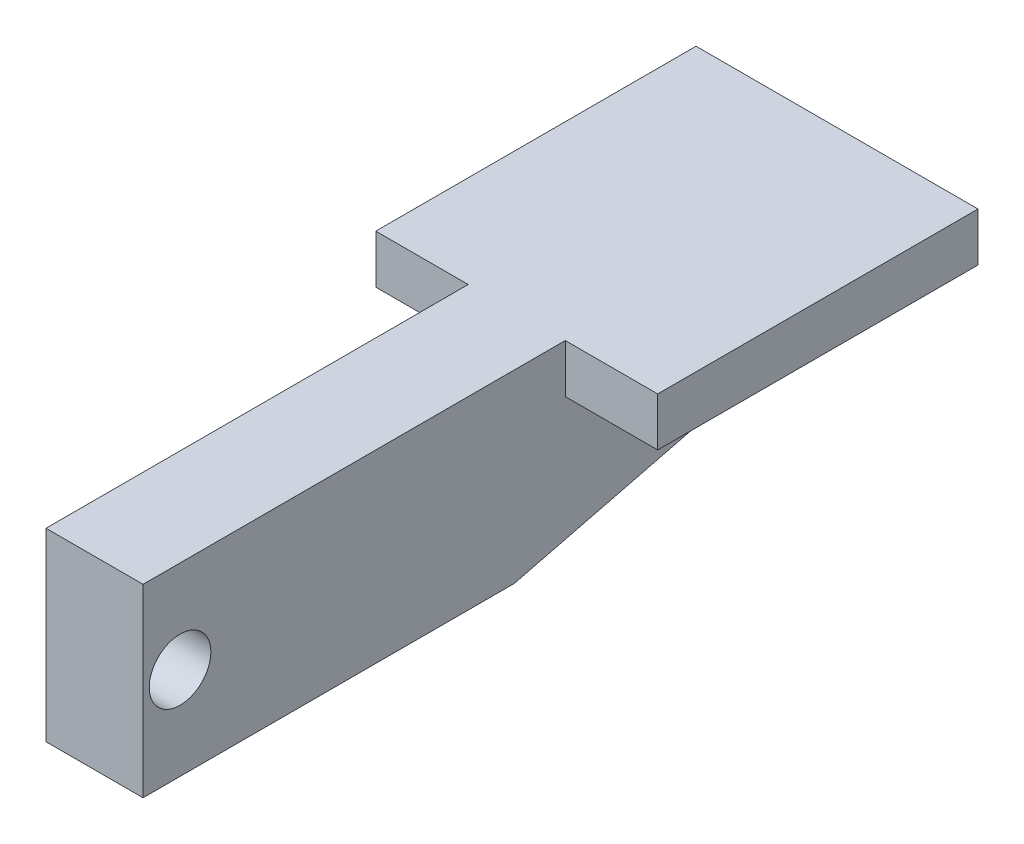
ISO-10303-21;
HEADER;
FILE_DESCRIPTION(('STEP AP214'),'2;1');
FILE_NAME('part.step','',(''),(''),'','','');
FILE_SCHEMA(('AUTOMOTIVE_DESIGN { 1 0 10303 214 1 1 1 1 }'));
ENDSEC;
DATA;
#1=APPLICATION_CONTEXT('core data for automotive mechanical design processes');
#2=APPLICATION_PROTOCOL_DEFINITION('international standard','automotive_design',2000,#1);
#3=PRODUCT_CONTEXT('',#1,'mechanical');
#4=PRODUCT('Part','Part','',(#3));
#5=PRODUCT_RELATED_PRODUCT_CATEGORY('part','',(#4));
#6=PRODUCT_DEFINITION_FORMATION('','',#4);
#7=PRODUCT_DEFINITION_CONTEXT('part definition',#1,'design');
#8=PRODUCT_DEFINITION('design','',#6,#7);
#9=PRODUCT_DEFINITION_SHAPE('','',#8);
#10=(LENGTH_UNIT() NAMED_UNIT(*) SI_UNIT(.MILLI.,.METRE.));
#11=(NAMED_UNIT(*) PLANE_ANGLE_UNIT() SI_UNIT($,.RADIAN.));
#12=(NAMED_UNIT(*) SI_UNIT($,.STERADIAN.) SOLID_ANGLE_UNIT());
#13=UNCERTAINTY_MEASURE_WITH_UNIT(LENGTH_MEASURE(1.E-05),#10,'distance_accuracy_value','');
#14=(GEOMETRIC_REPRESENTATION_CONTEXT(3) GLOBAL_UNCERTAINTY_ASSIGNED_CONTEXT((#13)) GLOBAL_UNIT_ASSIGNED_CONTEXT((#10,
#11,#12)) REPRESENTATION_CONTEXT('',''));
#15=CARTESIAN_POINT('',(0.,0.,0.));
#16=DIRECTION('',(0.,0.,1.));
#17=DIRECTION('',(1.,0.,0.));
#18=AXIS2_PLACEMENT_3D('',#15,#16,#17);
#19=CARTESIAN_POINT('',(0.,0.,0.));
#20=DIRECTION('',(1.,0.,0.));
#21=DIRECTION('',(0.,0.,-1.));
#22=AXIS2_PLACEMENT_3D('',#19,#20,#21);
#23=PLANE('',#22);
#24=CARTESIAN_POINT('',(0.,0.,68.88));
#25=DIRECTION('',(1.,0.,0.));
#26=DIRECTION('',(0.,0.,-1.));
#27=AXIS2_PLACEMENT_3D('',#24,#25,#26);
#28=CIRCLE('',#27,6.35);
#29=CARTESIAN_POINT('',(0.,0.,62.53));
#30=VERTEX_POINT('',#29);
#31=EDGE_CURVE('E216',#30,#30,#28,.T.);
#32=ORIENTED_EDGE('',*,*,#31,.T.);
#33=EDGE_LOOP('',(#32));
#34=FACE_BOUND('',#33,.T.);
#35=DIRECTION('',(0.,1.,0.));
#36=VECTOR('',#35,1.);
#37=CARTESIAN_POINT('',(0.,19.05,-10.5));
#38=LINE('',#37,#36);
#39=CARTESIAN_POINT('',(0.,9.05,-10.5));
#40=VERTEX_POINT('',#39);
#41=CARTESIAN_POINT('',(0.,19.05,-10.5));
#42=VERTEX_POINT('',#41);
#43=EDGE_CURVE('E133',#40,#42,#38,.T.);
#44=ORIENTED_EDGE('',*,*,#43,.F.);
#45=DIRECTION('',(0.,0.,1.));
#46=VECTOR('',#45,1.);
#47=CARTESIAN_POINT('',(0.,9.05,-76.5));
#48=LINE('',#47,#46);
#49=CARTESIAN_POINT('',(0.,9.05,-76.5));
#50=VERTEX_POINT('',#49);
#51=EDGE_CURVE('E47',#50,#40,#48,.T.);
#52=ORIENTED_EDGE('',*,*,#51,.F.);
#53=DIRECTION('',(0.,1.,0.));
#54=VECTOR('',#53,1.);
#55=CARTESIAN_POINT('',(0.,19.05,-76.5));
#56=LINE('',#55,#54);
#57=CARTESIAN_POINT('',(0.,0.,-76.5));
#58=VERTEX_POINT('',#57);
#59=EDGE_CURVE('E137',#58,#50,#56,.T.);
#60=ORIENTED_EDGE('',*,*,#59,.F.);
#61=DIRECTION('',(0.,0.241640143717287,-0.97036593146312));
#62=VECTOR('',#61,1.);
#63=CARTESIAN_POINT('',(0.,-19.05,0.));
#64=LINE('',#63,#62);
#65=CARTESIAN_POINT('',(0.,-19.05,0.));
#66=VERTEX_POINT('',#65);
#67=EDGE_CURVE('E184',#66,#58,#64,.T.);
#68=ORIENTED_EDGE('',*,*,#67,.F.);
#69=DIRECTION('',(0.,0.,-1.));
#70=VECTOR('',#69,1.);
#71=CARTESIAN_POINT('',(0.,-19.05,76.5));
#72=LINE('',#71,#70);
#73=CARTESIAN_POINT('',(0.,-19.05,76.5));
#74=VERTEX_POINT('',#73);
#75=EDGE_CURVE('E182',#74,#66,#72,.T.);
#76=ORIENTED_EDGE('',*,*,#75,.F.);
#77=DIRECTION('',(0.,-1.,0.));
#78=VECTOR('',#77,1.);
#79=CARTESIAN_POINT('',(0.,19.05,76.5));
#80=LINE('',#79,#78);
#81=CARTESIAN_POINT('',(0.,19.05,76.5));
#82=VERTEX_POINT('',#81);
#83=EDGE_CURVE('E167',#82,#74,#80,.T.);
#84=ORIENTED_EDGE('',*,*,#83,.F.);
#85=DIRECTION('',(0.,0.,1.));
#86=VECTOR('',#85,1.);
#87=CARTESIAN_POINT('',(0.,19.05,76.5));
#88=LINE('',#87,#86);
#89=EDGE_CURVE('E53',#42,#82,#88,.T.);
#90=ORIENTED_EDGE('',*,*,#89,.F.);
#91=EDGE_LOOP('',(#44,#52,#60,#68,#76,#84,#90));
#92=FACE_BOUND('',#91,.T.);
#93=ADVANCED_FACE('F32',(#34,#92),#23,.F.);
#94=CARTESIAN_POINT('',(20.,19.05,76.5));
#95=DIRECTION('',(0.,0.,-1.));
#96=DIRECTION('',(-1.,0.,0.));
#97=AXIS2_PLACEMENT_3D('',#94,#95,#96);
#98=PLANE('',#97);
#99=ORIENTED_EDGE('',*,*,#83,.T.);
#100=DIRECTION('',(-1.,0.,0.));
#101=VECTOR('',#100,1.);
#102=CARTESIAN_POINT('',(20.,-19.05,76.5));
#103=LINE('',#102,#101);
#104=CARTESIAN_POINT('',(20.,-19.05,76.5));
#105=VERTEX_POINT('',#104);
#106=EDGE_CURVE('E11',#105,#74,#103,.T.);
#107=ORIENTED_EDGE('',*,*,#106,.F.);
#108=DIRECTION('',(0.,-1.,0.));
#109=VECTOR('',#108,1.);
#110=CARTESIAN_POINT('',(20.,19.05,76.5));
#111=LINE('',#110,#109);
#112=CARTESIAN_POINT('',(20.,19.05,76.5));
#113=VERTEX_POINT('',#112);
#114=EDGE_CURVE('E168',#113,#105,#111,.T.);
#115=ORIENTED_EDGE('',*,*,#114,.F.);
#116=DIRECTION('',(-1.,0.,0.));
#117=VECTOR('',#116,1.);
#118=CARTESIAN_POINT('',(20.,19.05,76.5));
#119=LINE('',#118,#117);
#120=EDGE_CURVE('E179',#113,#82,#119,.T.);
#121=ORIENTED_EDGE('',*,*,#120,.T.);
#122=EDGE_LOOP('',(#99,#107,#115,#121));
#123=FACE_BOUND('',#122,.T.);
#124=ADVANCED_FACE('F34',(#123),#98,.F.);
#125=CARTESIAN_POINT('',(20.,-19.05,76.5));
#126=DIRECTION('',(0.,1.,0.));
#127=DIRECTION('',(0.,0.,1.));
#128=AXIS2_PLACEMENT_3D('',#125,#126,#127);
#129=PLANE('',#128);
#130=ORIENTED_EDGE('',*,*,#75,.T.);
#131=DIRECTION('',(-1.,0.,0.));
#132=VECTOR('',#131,1.);
#133=CARTESIAN_POINT('',(20.,-19.05,0.));
#134=LINE('',#133,#132);
#135=CARTESIAN_POINT('',(20.,-19.05,0.));
#136=VERTEX_POINT('',#135);
#137=EDGE_CURVE('E40',#136,#66,#134,.T.);
#138=ORIENTED_EDGE('',*,*,#137,.F.);
#139=DIRECTION('',(0.,0.,-1.));
#140=VECTOR('',#139,1.);
#141=CARTESIAN_POINT('',(20.,-19.05,76.5));
#142=LINE('',#141,#140);
#143=EDGE_CURVE('E171',#105,#136,#142,.T.);
#144=ORIENTED_EDGE('',*,*,#143,.F.);
#145=ORIENTED_EDGE('',*,*,#106,.T.);
#146=EDGE_LOOP('',(#130,#138,#144,#145));
#147=FACE_BOUND('',#146,.T.);
#148=ADVANCED_FACE('F202',(#147),#129,.F.);
#149=CARTESIAN_POINT('',(20.,-19.05,0.));
#150=DIRECTION('',(0.,0.97036593146312,0.241640143717287));
#151=DIRECTION('',(0.,-0.241640143717287,0.97036593146312));
#152=AXIS2_PLACEMENT_3D('',#149,#150,#151);
#153=PLANE('',#152);
#154=ORIENTED_EDGE('',*,*,#67,.T.);
#155=DIRECTION('',(-1.,0.,0.));
#156=VECTOR('',#155,1.);
#157=CARTESIAN_POINT('',(20.,0.,-76.5));
#158=LINE('',#157,#156);
#159=CARTESIAN_POINT('',(20.,0.,-76.5));
#160=VERTEX_POINT('',#159);
#161=EDGE_CURVE('E192',#160,#58,#158,.T.);
#162=ORIENTED_EDGE('',*,*,#161,.F.);
#163=DIRECTION('',(0.,0.241640143717287,-0.97036593146312));
#164=VECTOR('',#163,1.);
#165=CARTESIAN_POINT('',(20.,-19.05,0.));
#166=LINE('',#165,#164);
#167=EDGE_CURVE('E173',#136,#160,#166,.T.);
#168=ORIENTED_EDGE('',*,*,#167,.F.);
#169=ORIENTED_EDGE('',*,*,#137,.T.);
#170=EDGE_LOOP('',(#154,#162,#168,#169));
#171=FACE_BOUND('',#170,.T.);
#172=ADVANCED_FACE('F198',(#171),#153,.F.);
#173=CARTESIAN_POINT('',(20.,19.05,-76.5));
#174=DIRECTION('',(0.,0.,1.));
#175=DIRECTION('',(1.,0.,0.));
#176=AXIS2_PLACEMENT_3D('',#173,#174,#175);
#177=PLANE('',#176);
#178=ORIENTED_EDGE('',*,*,#59,.T.);
#179=DIRECTION('',(1.,0.,0.));
#180=VECTOR('',#179,1.);
#181=CARTESIAN_POINT('',(-19.05,9.05,-76.5));
#182=LINE('',#181,#180);
#183=CARTESIAN_POINT('',(-19.05,9.05,-76.5));
#184=VERTEX_POINT('',#183);
#185=EDGE_CURVE('E119',#184,#50,#182,.T.);
#186=ORIENTED_EDGE('',*,*,#185,.F.);
#187=DIRECTION('',(0.,-1.,0.));
#188=VECTOR('',#187,1.);
#189=CARTESIAN_POINT('',(-19.05,19.05,-76.5));
#190=LINE('',#189,#188);
#191=CARTESIAN_POINT('',(-19.05,19.05,-76.5));
#192=VERTEX_POINT('',#191);
#193=EDGE_CURVE('E125',#192,#184,#190,.T.);
#194=ORIENTED_EDGE('',*,*,#193,.F.);
#195=DIRECTION('',(-1.,0.,0.));
#196=VECTOR('',#195,1.);
#197=CARTESIAN_POINT('',(20.,19.05,-76.5));
#198=LINE('',#197,#196);
#199=CARTESIAN_POINT('',(39.05,19.05,-76.5));
#200=VERTEX_POINT('',#199);
#201=EDGE_CURVE('E190',#200,#192,#198,.T.);
#202=ORIENTED_EDGE('',*,*,#201,.F.);
#203=DIRECTION('',(0.,1.,0.));
#204=VECTOR('',#203,1.);
#205=CARTESIAN_POINT('',(39.05,19.05,-76.5));
#206=LINE('',#205,#204);
#207=CARTESIAN_POINT('',(39.05,9.05,-76.5));
#208=VERTEX_POINT('',#207);
#209=EDGE_CURVE('E147',#208,#200,#206,.T.);
#210=ORIENTED_EDGE('',*,*,#209,.F.);
#211=DIRECTION('',(-1.,0.,0.));
#212=VECTOR('',#211,1.);
#213=CARTESIAN_POINT('',(39.05,9.05,-76.5));
#214=LINE('',#213,#212);
#215=CARTESIAN_POINT('',(20.,9.04999999999999,-76.5));
#216=VERTEX_POINT('',#215);
#217=EDGE_CURVE('E155',#208,#216,#214,.T.);
#218=ORIENTED_EDGE('',*,*,#217,.T.);
#219=DIRECTION('',(0.,1.,0.));
#220=VECTOR('',#219,1.);
#221=CARTESIAN_POINT('',(20.,19.05,-76.5));
#222=LINE('',#221,#220);
#223=EDGE_CURVE('E175',#160,#216,#222,.T.);
#224=ORIENTED_EDGE('',*,*,#223,.F.);
#225=ORIENTED_EDGE('',*,*,#161,.T.);
#226=EDGE_LOOP('',(#178,#186,#194,#202,#210,#218,#224,#225));
#227=FACE_BOUND('',#226,.T.);
#228=ADVANCED_FACE('F135',(#227),#177,.F.);
#229=CARTESIAN_POINT('',(20.,19.05,76.5));
#230=DIRECTION('',(0.,-1.,0.));
#231=DIRECTION('',(0.,0.,-1.));
#232=AXIS2_PLACEMENT_3D('',#229,#230,#231);
#233=PLANE('',#232);
#234=ORIENTED_EDGE('',*,*,#201,.T.);
#235=DIRECTION('',(0.,0.,-1.));
#236=VECTOR('',#235,1.);
#237=CARTESIAN_POINT('',(-19.05,19.05,-76.5));
#238=LINE('',#237,#236);
#239=CARTESIAN_POINT('',(-19.05,19.05,-10.5));
#240=VERTEX_POINT('',#239);
#241=EDGE_CURVE('E131',#240,#192,#238,.T.);
#242=ORIENTED_EDGE('',*,*,#241,.F.);
#243=DIRECTION('',(1.,0.,0.));
#244=VECTOR('',#243,1.);
#245=CARTESIAN_POINT('',(-19.05,19.05,-10.5));
#246=LINE('',#245,#244);
#247=EDGE_CURVE('E143',#240,#42,#246,.T.);
#248=ORIENTED_EDGE('',*,*,#247,.T.);
#249=ORIENTED_EDGE('',*,*,#89,.T.);
#250=ORIENTED_EDGE('',*,*,#120,.F.);
#251=DIRECTION('',(0.,0.,1.));
#252=VECTOR('',#251,1.);
#253=CARTESIAN_POINT('',(20.,19.05,76.5));
#254=LINE('',#253,#252);
#255=CARTESIAN_POINT('',(20.,19.05,-10.5));
#256=VERTEX_POINT('',#255);
#257=EDGE_CURVE('E177',#256,#113,#254,.T.);
#258=ORIENTED_EDGE('',*,*,#257,.F.);
#259=DIRECTION('',(-1.,0.,0.));
#260=VECTOR('',#259,1.);
#261=CARTESIAN_POINT('',(39.05,19.05,-10.5));
#262=LINE('',#261,#260);
#263=CARTESIAN_POINT('',(39.05,19.05,-10.5));
#264=VERTEX_POINT('',#263);
#265=EDGE_CURVE('E164',#264,#256,#262,.T.);
#266=ORIENTED_EDGE('',*,*,#265,.F.);
#267=DIRECTION('',(0.,0.,1.));
#268=VECTOR('',#267,1.);
#269=CARTESIAN_POINT('',(39.05,19.05,-76.5));
#270=LINE('',#269,#268);
#271=EDGE_CURVE('E150',#200,#264,#270,.T.);
#272=ORIENTED_EDGE('',*,*,#271,.F.);
#273=EDGE_LOOP('',(#234,#242,#248,#249,#250,#258,#266,#272));
#274=FACE_BOUND('',#273,.T.);
#275=ADVANCED_FACE('F208',(#274),#233,.F.);
#276=CARTESIAN_POINT('',(20.,0.,0.));
#277=DIRECTION('',(1.,0.,0.));
#278=DIRECTION('',(0.,0.,-1.));
#279=AXIS2_PLACEMENT_3D('',#276,#277,#278);
#280=PLANE('',#279);
#281=CARTESIAN_POINT('',(20.,0.,68.88));
#282=DIRECTION('',(1.,0.,0.));
#283=DIRECTION('',(0.,0.,-1.));
#284=AXIS2_PLACEMENT_3D('',#281,#282,#283);
#285=CIRCLE('',#284,6.35);
#286=CARTESIAN_POINT('',(20.,0.,62.53));
#287=VERTEX_POINT('',#286);
#288=EDGE_CURVE('E221',#287,#287,#285,.T.);
#289=ORIENTED_EDGE('',*,*,#288,.F.);
#290=EDGE_LOOP('',(#289));
#291=FACE_BOUND('',#290,.T.);
#292=DIRECTION('',(0.,0.,-1.));
#293=VECTOR('',#292,1.);
#294=CARTESIAN_POINT('',(20.,9.05,-76.5));
#295=LINE('',#294,#293);
#296=CARTESIAN_POINT('',(20.,9.04999999999999,-10.5));
#297=VERTEX_POINT('',#296);
#298=EDGE_CURVE('E141',#297,#216,#295,.T.);
#299=ORIENTED_EDGE('',*,*,#298,.F.);
#300=DIRECTION('',(0.,-1.,0.));
#301=VECTOR('',#300,1.);
#302=CARTESIAN_POINT('',(20.,19.05,-10.5));
#303=LINE('',#302,#301);
#304=EDGE_CURVE('E138',#256,#297,#303,.T.);
#305=ORIENTED_EDGE('',*,*,#304,.F.);
#306=ORIENTED_EDGE('',*,*,#257,.T.);
#307=ORIENTED_EDGE('',*,*,#114,.T.);
#308=ORIENTED_EDGE('',*,*,#143,.T.);
#309=ORIENTED_EDGE('',*,*,#167,.T.);
#310=ORIENTED_EDGE('',*,*,#223,.T.);
#311=EDGE_LOOP('',(#299,#305,#306,#307,#308,#309,#310));
#312=FACE_BOUND('',#311,.T.);
#313=ADVANCED_FACE('F228',(#291,#312),#280,.T.);
#314=CARTESIAN_POINT('',(39.05,19.05,-10.5));
#315=DIRECTION('',(0.,0.,-1.));
#316=DIRECTION('',(0.,1.,0.));
#317=AXIS2_PLACEMENT_3D('',#314,#315,#316);
#318=PLANE('',#317);
#319=ORIENTED_EDGE('',*,*,#304,.T.);
#320=DIRECTION('',(-1.,0.,0.));
#321=VECTOR('',#320,1.);
#322=CARTESIAN_POINT('',(39.05,9.04999999999999,-10.5));
#323=LINE('',#322,#321);
#324=CARTESIAN_POINT('',(39.05,9.04999999999999,-10.5));
#325=VERTEX_POINT('',#324);
#326=EDGE_CURVE('E161',#325,#297,#323,.T.);
#327=ORIENTED_EDGE('',*,*,#326,.F.);
#328=DIRECTION('',(0.,-1.,0.));
#329=VECTOR('',#328,1.);
#330=CARTESIAN_POINT('',(39.05,19.05,-10.5));
#331=LINE('',#330,#329);
#332=EDGE_CURVE('E152',#264,#325,#331,.T.);
#333=ORIENTED_EDGE('',*,*,#332,.F.);
#334=ORIENTED_EDGE('',*,*,#265,.T.);
#335=EDGE_LOOP('',(#319,#327,#333,#334));
#336=FACE_BOUND('',#335,.T.);
#337=ADVANCED_FACE('F231',(#336),#318,.F.);
#338=CARTESIAN_POINT('',(39.05,9.05,-76.5));
#339=DIRECTION('',(0.,1.,0.));
#340=DIRECTION('',(0.,0.,1.));
#341=AXIS2_PLACEMENT_3D('',#338,#339,#340);
#342=PLANE('',#341);
#343=ORIENTED_EDGE('',*,*,#298,.T.);
#344=ORIENTED_EDGE('',*,*,#217,.F.);
#345=DIRECTION('',(0.,0.,-1.));
#346=VECTOR('',#345,1.);
#347=CARTESIAN_POINT('',(39.05,9.05,-76.5));
#348=LINE('',#347,#346);
#349=EDGE_CURVE('E154',#325,#208,#348,.T.);
#350=ORIENTED_EDGE('',*,*,#349,.F.);
#351=ORIENTED_EDGE('',*,*,#326,.T.);
#352=EDGE_LOOP('',(#343,#344,#350,#351));
#353=FACE_BOUND('',#352,.T.);
#354=ADVANCED_FACE('F240',(#353),#342,.F.);
#355=CARTESIAN_POINT('',(39.05,0.,0.));
#356=DIRECTION('',(-1.,0.,0.));
#357=DIRECTION('',(0.,0.,1.));
#358=AXIS2_PLACEMENT_3D('',#355,#356,#357);
#359=PLANE('',#358);
#360=ORIENTED_EDGE('',*,*,#209,.T.);
#361=ORIENTED_EDGE('',*,*,#271,.T.);
#362=ORIENTED_EDGE('',*,*,#332,.T.);
#363=ORIENTED_EDGE('',*,*,#349,.T.);
#364=EDGE_LOOP('',(#360,#361,#362,#363));
#365=FACE_BOUND('',#364,.T.);
#366=ADVANCED_FACE('F243',(#365),#359,.F.);
#367=CARTESIAN_POINT('',(-19.05,9.05,-76.5));
#368=DIRECTION('',(0.,1.,0.));
#369=DIRECTION('',(0.,0.,1.));
#370=AXIS2_PLACEMENT_3D('',#367,#368,#369);
#371=PLANE('',#370);
#372=ORIENTED_EDGE('',*,*,#51,.T.);
#373=DIRECTION('',(1.,0.,0.));
#374=VECTOR('',#373,1.);
#375=CARTESIAN_POINT('',(-19.05,9.05,-10.5));
#376=LINE('',#375,#374);
#377=CARTESIAN_POINT('',(-19.05,9.05,-10.5));
#378=VERTEX_POINT('',#377);
#379=EDGE_CURVE('E121',#378,#40,#376,.T.);
#380=ORIENTED_EDGE('',*,*,#379,.F.);
#381=DIRECTION('',(0.,0.,1.));
#382=VECTOR('',#381,1.);
#383=CARTESIAN_POINT('',(-19.05,9.05,-76.5));
#384=LINE('',#383,#382);
#385=EDGE_CURVE('E115',#184,#378,#384,.T.);
#386=ORIENTED_EDGE('',*,*,#385,.F.);
#387=ORIENTED_EDGE('',*,*,#185,.T.);
#388=EDGE_LOOP('',(#372,#380,#386,#387));
#389=FACE_BOUND('',#388,.T.);
#390=ADVANCED_FACE('F117',(#389),#371,.F.);
#391=CARTESIAN_POINT('',(-19.05,19.05,-10.5));
#392=DIRECTION('',(0.,0.,-1.));
#393=DIRECTION('',(0.,1.,0.));
#394=AXIS2_PLACEMENT_3D('',#391,#392,#393);
#395=PLANE('',#394);
#396=ORIENTED_EDGE('',*,*,#43,.T.);
#397=ORIENTED_EDGE('',*,*,#247,.F.);
#398=DIRECTION('',(0.,1.,0.));
#399=VECTOR('',#398,1.);
#400=CARTESIAN_POINT('',(-19.05,19.05,-10.5));
#401=LINE('',#400,#399);
#402=EDGE_CURVE('E124',#378,#240,#401,.T.);
#403=ORIENTED_EDGE('',*,*,#402,.F.);
#404=ORIENTED_EDGE('',*,*,#379,.T.);
#405=EDGE_LOOP('',(#396,#397,#403,#404));
#406=FACE_BOUND('',#405,.T.);
#407=ADVANCED_FACE('F251',(#406),#395,.F.);
#408=CARTESIAN_POINT('',(-19.05,0.,0.));
#409=DIRECTION('',(-1.,0.,0.));
#410=DIRECTION('',(0.,0.,1.));
#411=AXIS2_PLACEMENT_3D('',#408,#409,#410);
#412=PLANE('',#411);
#413=ORIENTED_EDGE('',*,*,#193,.T.);
#414=ORIENTED_EDGE('',*,*,#385,.T.);
#415=ORIENTED_EDGE('',*,*,#402,.T.);
#416=ORIENTED_EDGE('',*,*,#241,.T.);
#417=EDGE_LOOP('',(#413,#414,#415,#416));
#418=FACE_BOUND('',#417,.T.);
#419=ADVANCED_FACE('F129',(#418),#412,.T.);
#420=CARTESIAN_POINT('',(-19.05,0.,68.88));
#421=DIRECTION('',(1.,0.,0.));
#422=DIRECTION('',(0.,0.,-1.));
#423=AXIS2_PLACEMENT_3D('',#420,#421,#422);
#424=CYLINDRICAL_SURFACE('',#423,6.35);
#425=ORIENTED_EDGE('',*,*,#288,.T.);
#426=EDGE_LOOP('',(#425));
#427=FACE_BOUND('',#426,.T.);
#428=ORIENTED_EDGE('',*,*,#31,.F.);
#429=EDGE_LOOP('',(#428));
#430=FACE_BOUND('',#429,.T.);
#431=ADVANCED_FACE('F225',(#427,#430),#424,.F.);
#432=CLOSED_SHELL('',(#93,#124,#148,#172,#228,#275,#313,#337,#354,#366,#390,#407,#419,#431));
#433=MANIFOLD_SOLID_BREP('B2',#432);
#434=ADVANCED_BREP_SHAPE_REPRESENTATION('',(#18,#433),#14);
#435=SHAPE_DEFINITION_REPRESENTATION(#9,#434);
ENDSEC;
END-ISO-10303-21;
